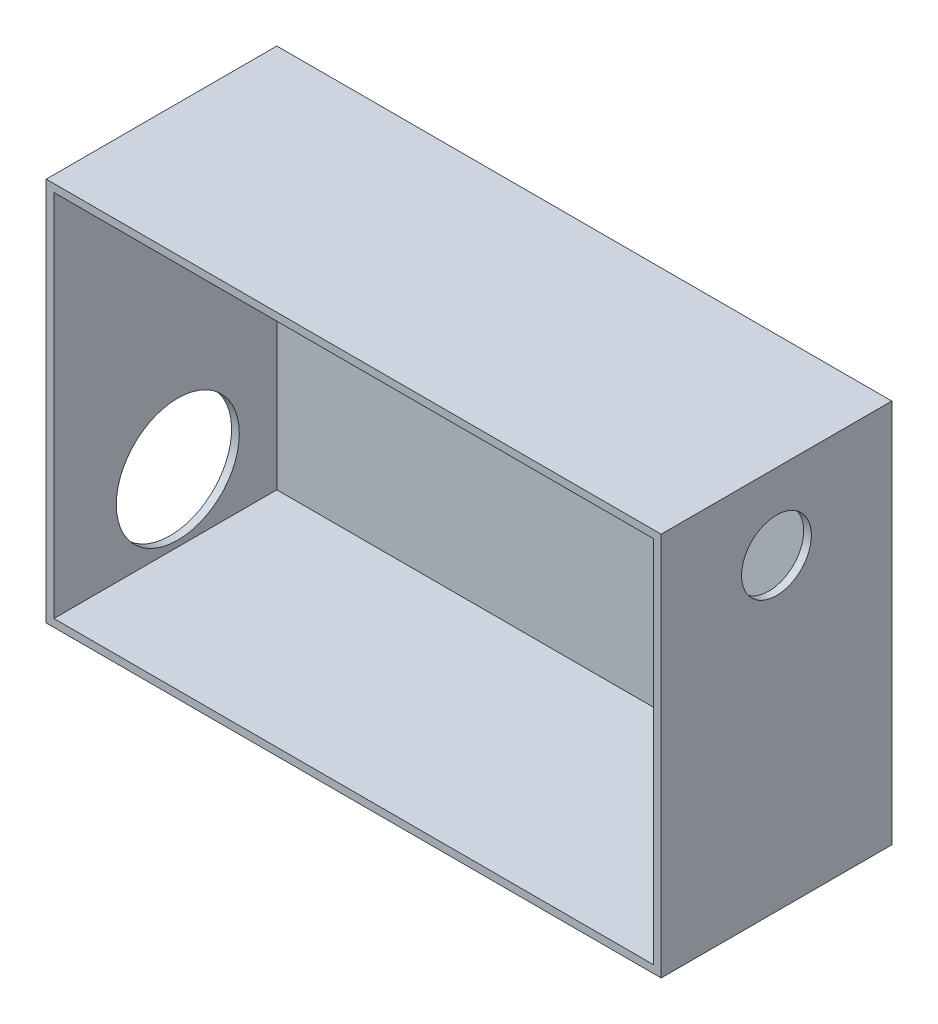
ISO-10303-21;
HEADER;
FILE_DESCRIPTION(('STEP AP214'),'2;1');
FILE_NAME('part.step','',(''),(''),'','','');
FILE_SCHEMA(('AUTOMOTIVE_DESIGN { 1 0 10303 214 1 1 1 1 }'));
ENDSEC;
DATA;
#1=APPLICATION_CONTEXT('core data for automotive mechanical design processes');
#2=APPLICATION_PROTOCOL_DEFINITION('international standard','automotive_design',2000,#1);
#3=PRODUCT_CONTEXT('',#1,'mechanical');
#4=PRODUCT('Part','Part','',(#3));
#5=PRODUCT_RELATED_PRODUCT_CATEGORY('part','',(#4));
#6=PRODUCT_DEFINITION_FORMATION('','',#4);
#7=PRODUCT_DEFINITION_CONTEXT('part definition',#1,'design');
#8=PRODUCT_DEFINITION('design','',#6,#7);
#9=PRODUCT_DEFINITION_SHAPE('','',#8);
#10=(LENGTH_UNIT() NAMED_UNIT(*) SI_UNIT(.MILLI.,.METRE.));
#11=(NAMED_UNIT(*) PLANE_ANGLE_UNIT() SI_UNIT($,.RADIAN.));
#12=(NAMED_UNIT(*) SI_UNIT($,.STERADIAN.) SOLID_ANGLE_UNIT());
#13=UNCERTAINTY_MEASURE_WITH_UNIT(LENGTH_MEASURE(1.E-05),#10,'distance_accuracy_value','');
#14=(GEOMETRIC_REPRESENTATION_CONTEXT(3) GLOBAL_UNCERTAINTY_ASSIGNED_CONTEXT((#13)) GLOBAL_UNIT_ASSIGNED_CONTEXT((#10,
#11,#12)) REPRESENTATION_CONTEXT('',''));
#15=CARTESIAN_POINT('',(0.,0.,0.));
#16=DIRECTION('',(0.,0.,1.));
#17=DIRECTION('',(1.,0.,0.));
#18=AXIS2_PLACEMENT_3D('',#15,#16,#17);
#19=CARTESIAN_POINT('',(40.,25.,30.));
#20=DIRECTION('',(-1.,0.,0.));
#21=DIRECTION('',(0.,0.,1.));
#22=AXIS2_PLACEMENT_3D('',#19,#20,#21);
#23=PLANE('',#22);
#24=CARTESIAN_POINT('',(40.,15.1172510042117,15.));
#25=DIRECTION('',(1.,0.,0.));
#26=DIRECTION('',(0.,0.,-1.));
#27=AXIS2_PLACEMENT_3D('',#24,#25,#26);
#28=CIRCLE('',#27,4.53946583268195);
#29=CARTESIAN_POINT('',(40.,15.1172510042117,10.460534167318));
#30=VERTEX_POINT('',#29);
#31=EDGE_CURVE('E195',#30,#30,#28,.T.);
#32=ORIENTED_EDGE('',*,*,#31,.F.);
#33=EDGE_LOOP('',(#32));
#34=FACE_BOUND('',#33,.T.);
#35=DIRECTION('',(0.,1.,0.));
#36=VECTOR('',#35,1.);
#37=CARTESIAN_POINT('',(40.,25.,0.));
#38=LINE('',#37,#36);
#39=CARTESIAN_POINT('',(40.,-25.,0.));
#40=VERTEX_POINT('',#39);
#41=CARTESIAN_POINT('',(40.,25.,0.));
#42=VERTEX_POINT('',#41);
#43=EDGE_CURVE('E173',#40,#42,#38,.T.);
#44=ORIENTED_EDGE('',*,*,#43,.T.);
#45=DIRECTION('',(0.,0.,-1.));
#46=VECTOR('',#45,1.);
#47=CARTESIAN_POINT('',(40.,25.,30.));
#48=LINE('',#47,#46);
#49=CARTESIAN_POINT('',(40.,25.,30.));
#50=VERTEX_POINT('',#49);
#51=EDGE_CURVE('E11',#50,#42,#48,.T.);
#52=ORIENTED_EDGE('',*,*,#51,.F.);
#53=DIRECTION('',(0.,1.,0.));
#54=VECTOR('',#53,1.);
#55=CARTESIAN_POINT('',(40.,25.,30.));
#56=LINE('',#55,#54);
#57=CARTESIAN_POINT('',(40.,-25.,30.));
#58=VERTEX_POINT('',#57);
#59=EDGE_CURVE('E162',#58,#50,#56,.T.);
#60=ORIENTED_EDGE('',*,*,#59,.F.);
#61=DIRECTION('',(0.,0.,-1.));
#62=VECTOR('',#61,1.);
#63=CARTESIAN_POINT('',(40.,-25.,30.));
#64=LINE('',#63,#62);
#65=EDGE_CURVE('E172',#58,#40,#64,.T.);
#66=ORIENTED_EDGE('',*,*,#65,.T.);
#67=EDGE_LOOP('',(#44,#52,#60,#66));
#68=FACE_BOUND('',#67,.T.);
#69=ADVANCED_FACE('F43',(#34,#68),#23,.F.);
#70=CARTESIAN_POINT('',(-40.,25.,30.));
#71=DIRECTION('',(0.,-1.,0.));
#72=DIRECTION('',(0.,0.,-1.));
#73=AXIS2_PLACEMENT_3D('',#70,#71,#72);
#74=PLANE('',#73);
#75=DIRECTION('',(-1.,0.,0.));
#76=VECTOR('',#75,1.);
#77=CARTESIAN_POINT('',(-40.,25.,0.));
#78=LINE('',#77,#76);
#79=CARTESIAN_POINT('',(-40.,25.,0.));
#80=VERTEX_POINT('',#79);
#81=EDGE_CURVE('E177',#42,#80,#78,.T.);
#82=ORIENTED_EDGE('',*,*,#81,.T.);
#83=DIRECTION('',(0.,0.,-1.));
#84=VECTOR('',#83,1.);
#85=CARTESIAN_POINT('',(-40.,25.,30.));
#86=LINE('',#85,#84);
#87=CARTESIAN_POINT('',(-40.,25.,30.));
#88=VERTEX_POINT('',#87);
#89=EDGE_CURVE('E52',#88,#80,#86,.T.);
#90=ORIENTED_EDGE('',*,*,#89,.F.);
#91=DIRECTION('',(-1.,0.,0.));
#92=VECTOR('',#91,1.);
#93=CARTESIAN_POINT('',(-40.,25.,30.));
#94=LINE('',#93,#92);
#95=EDGE_CURVE('E97',#50,#88,#94,.T.);
#96=ORIENTED_EDGE('',*,*,#95,.F.);
#97=ORIENTED_EDGE('',*,*,#51,.T.);
#98=EDGE_LOOP('',(#82,#90,#96,#97));
#99=FACE_BOUND('',#98,.T.);
#100=ADVANCED_FACE('F230',(#99),#74,.F.);
#101=CARTESIAN_POINT('',(-40.,25.,30.));
#102=DIRECTION('',(1.,0.,0.));
#103=DIRECTION('',(0.,1.,0.));
#104=AXIS2_PLACEMENT_3D('',#101,#102,#103);
#105=PLANE('',#104);
#106=CARTESIAN_POINT('',(-40.,-15.2290630498832,13.8815000025261));
#107=DIRECTION('',(-1.,0.,0.));
#108=DIRECTION('',(0.,-1.,0.));
#109=AXIS2_PLACEMENT_3D('',#106,#107,#108);
#110=CIRCLE('',#109,8.);
#111=CARTESIAN_POINT('',(-40.,-23.2290630498832,13.8815000025261));
#112=VERTEX_POINT('',#111);
#113=EDGE_CURVE('E207',#112,#112,#110,.T.);
#114=ORIENTED_EDGE('',*,*,#113,.F.);
#115=EDGE_LOOP('',(#114));
#116=FACE_BOUND('',#115,.T.);
#117=DIRECTION('',(0.,-1.,0.));
#118=VECTOR('',#117,1.);
#119=CARTESIAN_POINT('',(-40.,25.,0.));
#120=LINE('',#119,#118);
#121=CARTESIAN_POINT('',(-40.,-25.,0.));
#122=VERTEX_POINT('',#121);
#123=EDGE_CURVE('E180',#80,#122,#120,.T.);
#124=ORIENTED_EDGE('',*,*,#123,.T.);
#125=DIRECTION('',(0.,0.,-1.));
#126=VECTOR('',#125,1.);
#127=CARTESIAN_POINT('',(-40.,-25.,30.));
#128=LINE('',#127,#126);
#129=CARTESIAN_POINT('',(-40.,-25.,30.));
#130=VERTEX_POINT('',#129);
#131=EDGE_CURVE('E187',#130,#122,#128,.T.);
#132=ORIENTED_EDGE('',*,*,#131,.F.);
#133=DIRECTION('',(0.,-1.,0.));
#134=VECTOR('',#133,1.);
#135=CARTESIAN_POINT('',(-40.,25.,30.));
#136=LINE('',#135,#134);
#137=EDGE_CURVE('E167',#88,#130,#136,.T.);
#138=ORIENTED_EDGE('',*,*,#137,.F.);
#139=ORIENTED_EDGE('',*,*,#89,.T.);
#140=EDGE_LOOP('',(#124,#132,#138,#139));
#141=FACE_BOUND('',#140,.T.);
#142=ADVANCED_FACE('F235',(#116,#141),#105,.F.);
#143=CARTESIAN_POINT('',(-40.,-25.,30.));
#144=DIRECTION('',(0.,1.,0.));
#145=DIRECTION('',(0.,0.,1.));
#146=AXIS2_PLACEMENT_3D('',#143,#144,#145);
#147=PLANE('',#146);
#148=DIRECTION('',(1.,0.,0.));
#149=VECTOR('',#148,1.);
#150=CARTESIAN_POINT('',(-40.,-25.,0.));
#151=LINE('',#150,#149);
#152=EDGE_CURVE('E90',#122,#40,#151,.T.);
#153=ORIENTED_EDGE('',*,*,#152,.T.);
#154=ORIENTED_EDGE('',*,*,#65,.F.);
#155=DIRECTION('',(1.,0.,0.));
#156=VECTOR('',#155,1.);
#157=CARTESIAN_POINT('',(-40.,-25.,30.));
#158=LINE('',#157,#156);
#159=EDGE_CURVE('E69',#130,#58,#158,.T.);
#160=ORIENTED_EDGE('',*,*,#159,.F.);
#161=ORIENTED_EDGE('',*,*,#131,.T.);
#162=EDGE_LOOP('',(#153,#154,#160,#161));
#163=FACE_BOUND('',#162,.T.);
#164=ADVANCED_FACE('F224',(#163),#147,.F.);
#165=CARTESIAN_POINT('',(0.,0.,30.));
#166=DIRECTION('',(0.,0.,1.));
#167=DIRECTION('',(1.,0.,0.));
#168=AXIS2_PLACEMENT_3D('',#165,#166,#167);
#169=PLANE('',#168);
#170=DIRECTION('',(0.,1.,0.));
#171=VECTOR('',#170,1.);
#172=CARTESIAN_POINT('',(39.,25.,30.));
#173=LINE('',#172,#171);
#174=CARTESIAN_POINT('',(39.,-24.,30.));
#175=VERTEX_POINT('',#174);
#176=CARTESIAN_POINT('',(39.,24.,30.));
#177=VERTEX_POINT('',#176);
#178=EDGE_CURVE('E146',#175,#177,#173,.T.);
#179=ORIENTED_EDGE('',*,*,#178,.F.);
#180=DIRECTION('',(1.,0.,0.));
#181=VECTOR('',#180,1.);
#182=CARTESIAN_POINT('',(-40.,-24.,30.));
#183=LINE('',#182,#181);
#184=CARTESIAN_POINT('',(-39.,-24.,30.));
#185=VERTEX_POINT('',#184);
#186=EDGE_CURVE('E159',#185,#175,#183,.T.);
#187=ORIENTED_EDGE('',*,*,#186,.F.);
#188=DIRECTION('',(0.,-1.,0.));
#189=VECTOR('',#188,1.);
#190=CARTESIAN_POINT('',(-39.,25.,30.));
#191=LINE('',#190,#189);
#192=CARTESIAN_POINT('',(-39.,24.,30.));
#193=VERTEX_POINT('',#192);
#194=EDGE_CURVE('E156',#193,#185,#191,.T.);
#195=ORIENTED_EDGE('',*,*,#194,.F.);
#196=DIRECTION('',(-1.,0.,0.));
#197=VECTOR('',#196,1.);
#198=CARTESIAN_POINT('',(-40.,24.,30.));
#199=LINE('',#198,#197);
#200=EDGE_CURVE('E135',#177,#193,#199,.T.);
#201=ORIENTED_EDGE('',*,*,#200,.F.);
#202=EDGE_LOOP('',(#179,#187,#195,#201));
#203=FACE_BOUND('',#202,.T.);
#204=ORIENTED_EDGE('',*,*,#59,.T.);
#205=ORIENTED_EDGE('',*,*,#95,.T.);
#206=ORIENTED_EDGE('',*,*,#137,.T.);
#207=ORIENTED_EDGE('',*,*,#159,.T.);
#208=EDGE_LOOP('',(#204,#205,#206,#207));
#209=FACE_BOUND('',#208,.T.);
#210=ADVANCED_FACE('F221',(#203,#209),#169,.T.);
#211=CARTESIAN_POINT('',(0.,0.,0.));
#212=DIRECTION('',(0.,0.,1.));
#213=DIRECTION('',(1.,0.,0.));
#214=AXIS2_PLACEMENT_3D('',#211,#212,#213);
#215=PLANE('',#214);
#216=ORIENTED_EDGE('',*,*,#43,.F.);
#217=ORIENTED_EDGE('',*,*,#152,.F.);
#218=ORIENTED_EDGE('',*,*,#123,.F.);
#219=ORIENTED_EDGE('',*,*,#81,.F.);
#220=EDGE_LOOP('',(#216,#217,#218,#219));
#221=FACE_BOUND('',#220,.T.);
#222=ADVANCED_FACE('F223',(#221),#215,.F.);
#223=CARTESIAN_POINT('',(39.,25.,30.));
#224=DIRECTION('',(-1.,0.,0.));
#225=DIRECTION('',(0.,0.,1.));
#226=AXIS2_PLACEMENT_3D('',#223,#224,#225);
#227=PLANE('',#226);
#228=CARTESIAN_POINT('',(39.,15.1172510042117,15.));
#229=DIRECTION('',(-1.,0.,0.));
#230=DIRECTION('',(0.,0.,1.));
#231=AXIS2_PLACEMENT_3D('',#228,#229,#230);
#232=CIRCLE('',#231,4.53946583268195);
#233=CARTESIAN_POINT('',(39.,15.1172510042117,19.539465832682));
#234=VERTEX_POINT('',#233);
#235=EDGE_CURVE('E192',#234,#234,#232,.T.);
#236=ORIENTED_EDGE('',*,*,#235,.F.);
#237=EDGE_LOOP('',(#236));
#238=FACE_BOUND('',#237,.T.);
#239=DIRECTION('',(0.,1.,0.));
#240=VECTOR('',#239,1.);
#241=CARTESIAN_POINT('',(39.,25.,1.));
#242=LINE('',#241,#240);
#243=CARTESIAN_POINT('',(39.,-24.,1.));
#244=VERTEX_POINT('',#243);
#245=CARTESIAN_POINT('',(39.,24.,1.));
#246=VERTEX_POINT('',#245);
#247=EDGE_CURVE('E125',#244,#246,#242,.T.);
#248=ORIENTED_EDGE('',*,*,#247,.F.);
#249=DIRECTION('',(0.,0.,-1.));
#250=VECTOR('',#249,1.);
#251=CARTESIAN_POINT('',(39.,-24.,30.));
#252=LINE('',#251,#250);
#253=EDGE_CURVE('E150',#175,#244,#252,.T.);
#254=ORIENTED_EDGE('',*,*,#253,.F.);
#255=ORIENTED_EDGE('',*,*,#178,.T.);
#256=DIRECTION('',(0.,0.,-1.));
#257=VECTOR('',#256,1.);
#258=CARTESIAN_POINT('',(39.,24.,30.));
#259=LINE('',#258,#257);
#260=EDGE_CURVE('E139',#177,#246,#259,.T.);
#261=ORIENTED_EDGE('',*,*,#260,.T.);
#262=EDGE_LOOP('',(#248,#254,#255,#261));
#263=FACE_BOUND('',#262,.T.);
#264=ADVANCED_FACE('F219',(#238,#263),#227,.T.);
#265=CARTESIAN_POINT('',(-40.,24.,30.));
#266=DIRECTION('',(0.,-1.,0.));
#267=DIRECTION('',(0.,0.,-1.));
#268=AXIS2_PLACEMENT_3D('',#265,#266,#267);
#269=PLANE('',#268);
#270=DIRECTION('',(-1.,0.,0.));
#271=VECTOR('',#270,1.);
#272=CARTESIAN_POINT('',(-40.,24.,1.));
#273=LINE('',#272,#271);
#274=CARTESIAN_POINT('',(-39.,24.,1.));
#275=VERTEX_POINT('',#274);
#276=EDGE_CURVE('E119',#246,#275,#273,.T.);
#277=ORIENTED_EDGE('',*,*,#276,.F.);
#278=ORIENTED_EDGE('',*,*,#260,.F.);
#279=ORIENTED_EDGE('',*,*,#200,.T.);
#280=DIRECTION('',(0.,0.,-1.));
#281=VECTOR('',#280,1.);
#282=CARTESIAN_POINT('',(-39.,24.,30.));
#283=LINE('',#282,#281);
#284=EDGE_CURVE('E132',#193,#275,#283,.T.);
#285=ORIENTED_EDGE('',*,*,#284,.T.);
#286=EDGE_LOOP('',(#277,#278,#279,#285));
#287=FACE_BOUND('',#286,.T.);
#288=ADVANCED_FACE('F133',(#287),#269,.T.);
#289=CARTESIAN_POINT('',(-39.,25.,30.));
#290=DIRECTION('',(1.,0.,0.));
#291=DIRECTION('',(0.,1.,0.));
#292=AXIS2_PLACEMENT_3D('',#289,#290,#291);
#293=PLANE('',#292);
#294=CARTESIAN_POINT('',(-39.,-15.2290630498832,13.8815000025261));
#295=DIRECTION('',(1.,0.,0.));
#296=DIRECTION('',(0.,1.,0.));
#297=AXIS2_PLACEMENT_3D('',#294,#295,#296);
#298=CIRCLE('',#297,8.);
#299=CARTESIAN_POINT('',(-39.,-7.22906304988324,13.8815000025261));
#300=VERTEX_POINT('',#299);
#301=EDGE_CURVE('E46',#300,#300,#298,.T.);
#302=ORIENTED_EDGE('',*,*,#301,.F.);
#303=EDGE_LOOP('',(#302));
#304=FACE_BOUND('',#303,.T.);
#305=DIRECTION('',(0.,-1.,0.));
#306=VECTOR('',#305,1.);
#307=CARTESIAN_POINT('',(-39.,25.,1.));
#308=LINE('',#307,#306);
#309=CARTESIAN_POINT('',(-39.,-24.,1.));
#310=VERTEX_POINT('',#309);
#311=EDGE_CURVE('E123',#275,#310,#308,.T.);
#312=ORIENTED_EDGE('',*,*,#311,.F.);
#313=ORIENTED_EDGE('',*,*,#284,.F.);
#314=ORIENTED_EDGE('',*,*,#194,.T.);
#315=DIRECTION('',(0.,0.,-1.));
#316=VECTOR('',#315,1.);
#317=CARTESIAN_POINT('',(-39.,-24.,30.));
#318=LINE('',#317,#316);
#319=EDGE_CURVE('E60',#185,#310,#318,.T.);
#320=ORIENTED_EDGE('',*,*,#319,.T.);
#321=EDGE_LOOP('',(#312,#313,#314,#320));
#322=FACE_BOUND('',#321,.T.);
#323=ADVANCED_FACE('F141',(#304,#322),#293,.T.);
#324=CARTESIAN_POINT('',(-40.,-24.,30.));
#325=DIRECTION('',(0.,1.,0.));
#326=DIRECTION('',(0.,0.,1.));
#327=AXIS2_PLACEMENT_3D('',#324,#325,#326);
#328=PLANE('',#327);
#329=DIRECTION('',(1.,0.,0.));
#330=VECTOR('',#329,1.);
#331=CARTESIAN_POINT('',(-40.,-24.,1.));
#332=LINE('',#331,#330);
#333=EDGE_CURVE('E143',#310,#244,#332,.T.);
#334=ORIENTED_EDGE('',*,*,#333,.F.);
#335=ORIENTED_EDGE('',*,*,#319,.F.);
#336=ORIENTED_EDGE('',*,*,#186,.T.);
#337=ORIENTED_EDGE('',*,*,#253,.T.);
#338=EDGE_LOOP('',(#334,#335,#336,#337));
#339=FACE_BOUND('',#338,.T.);
#340=ADVANCED_FACE('F215',(#339),#328,.T.);
#341=CARTESIAN_POINT('',(0.,0.,1.));
#342=DIRECTION('',(0.,0.,1.));
#343=DIRECTION('',(1.,0.,0.));
#344=AXIS2_PLACEMENT_3D('',#341,#342,#343);
#345=PLANE('',#344);
#346=ORIENTED_EDGE('',*,*,#247,.T.);
#347=ORIENTED_EDGE('',*,*,#276,.T.);
#348=ORIENTED_EDGE('',*,*,#311,.T.);
#349=ORIENTED_EDGE('',*,*,#333,.T.);
#350=EDGE_LOOP('',(#346,#347,#348,#349));
#351=FACE_BOUND('',#350,.T.);
#352=ADVANCED_FACE('F121',(#351),#345,.T.);
#353=CARTESIAN_POINT('',(9.99999999999999,15.1172510042117,15.));
#354=DIRECTION('',(1.,0.,0.));
#355=DIRECTION('',(0.,0.,-1.));
#356=AXIS2_PLACEMENT_3D('',#353,#354,#355);
#357=CYLINDRICAL_SURFACE('',#356,4.53946583268195);
#358=ORIENTED_EDGE('',*,*,#235,.T.);
#359=EDGE_LOOP('',(#358));
#360=FACE_BOUND('',#359,.T.);
#361=ORIENTED_EDGE('',*,*,#31,.T.);
#362=EDGE_LOOP('',(#361));
#363=FACE_BOUND('',#362,.T.);
#364=ADVANCED_FACE('F296',(#360,#363),#357,.F.);
#365=CARTESIAN_POINT('',(-10.,-15.2290630498832,13.8815000025261));
#366=DIRECTION('',(-1.,0.,0.));
#367=DIRECTION('',(0.,-1.,0.));
#368=AXIS2_PLACEMENT_3D('',#365,#366,#367);
#369=CYLINDRICAL_SURFACE('',#368,8.);
#370=ORIENTED_EDGE('',*,*,#301,.T.);
#371=EDGE_LOOP('',(#370));
#372=FACE_BOUND('',#371,.T.);
#373=ORIENTED_EDGE('',*,*,#113,.T.);
#374=EDGE_LOOP('',(#373));
#375=FACE_BOUND('',#374,.T.);
#376=ADVANCED_FACE('F318',(#372,#375),#369,.F.);
#377=CLOSED_SHELL('',(#69,#100,#142,#164,#210,#222,#264,#288,#323,#340,#352,#364,#376));
#378=MANIFOLD_SOLID_BREP('B2',#377);
#379=ADVANCED_BREP_SHAPE_REPRESENTATION('',(#18,#378),#14);
#380=SHAPE_DEFINITION_REPRESENTATION(#9,#379);
ENDSEC;
END-ISO-10303-21;
